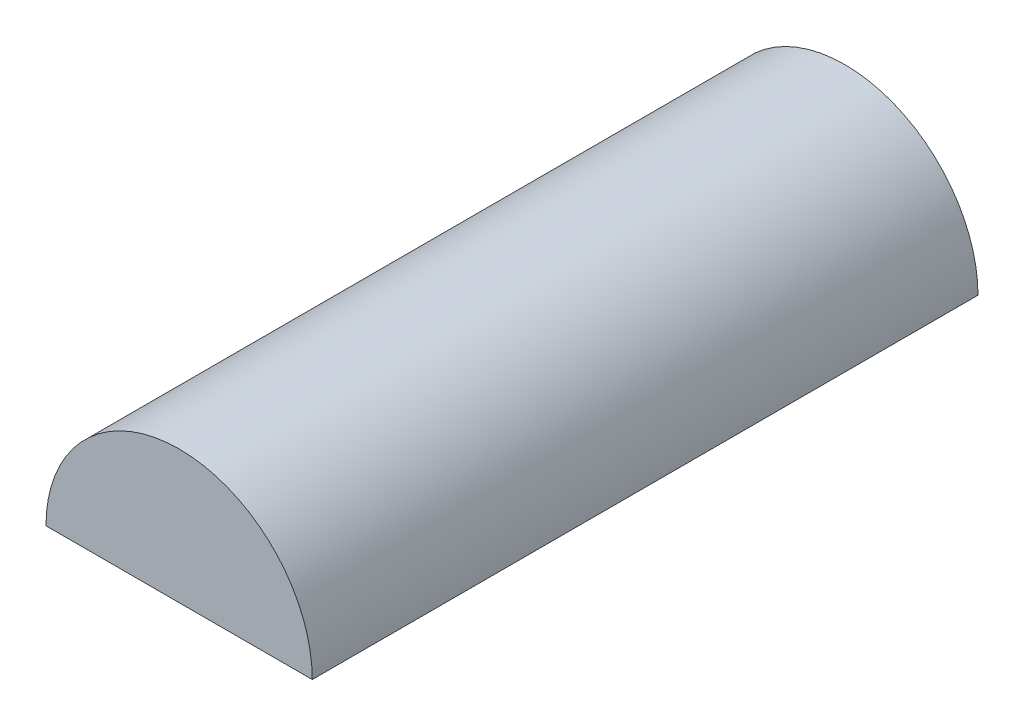
ISO-10303-21;
HEADER;
FILE_DESCRIPTION(('STEP AP214'),'2;1');
FILE_NAME('part.step','',(''),(''),'','','');
FILE_SCHEMA(('AUTOMOTIVE_DESIGN { 1 0 10303 214 1 1 1 1 }'));
ENDSEC;
DATA;
#1=APPLICATION_CONTEXT('core data for automotive mechanical design processes');
#2=APPLICATION_PROTOCOL_DEFINITION('international standard','automotive_design',2000,#1);
#3=PRODUCT_CONTEXT('',#1,'mechanical');
#4=PRODUCT('Part','Part','',(#3));
#5=PRODUCT_RELATED_PRODUCT_CATEGORY('part','',(#4));
#6=PRODUCT_DEFINITION_FORMATION('','',#4);
#7=PRODUCT_DEFINITION_CONTEXT('part definition',#1,'design');
#8=PRODUCT_DEFINITION('design','',#6,#7);
#9=PRODUCT_DEFINITION_SHAPE('','',#8);
#10=(LENGTH_UNIT() NAMED_UNIT(*) SI_UNIT(.MILLI.,.METRE.));
#11=(NAMED_UNIT(*) PLANE_ANGLE_UNIT() SI_UNIT($,.RADIAN.));
#12=(NAMED_UNIT(*) SI_UNIT($,.STERADIAN.) SOLID_ANGLE_UNIT());
#13=UNCERTAINTY_MEASURE_WITH_UNIT(LENGTH_MEASURE(1.E-05),#10,'distance_accuracy_value','');
#14=(GEOMETRIC_REPRESENTATION_CONTEXT(3) GLOBAL_UNCERTAINTY_ASSIGNED_CONTEXT((#13)) GLOBAL_UNIT_ASSIGNED_CONTEXT((#10,
#11,#12)) REPRESENTATION_CONTEXT('',''));
#15=CARTESIAN_POINT('',(0.,0.,0.));
#16=DIRECTION('',(0.,0.,1.));
#17=DIRECTION('',(1.,0.,0.));
#18=AXIS2_PLACEMENT_3D('',#15,#16,#17);
#19=CARTESIAN_POINT('',(0.,0.,500.));
#20=DIRECTION('',(0.,0.,-1.));
#21=DIRECTION('',(-1.,0.,0.));
#22=AXIS2_PLACEMENT_3D('',#19,#20,#21);
#23=CYLINDRICAL_SURFACE('',#22,100.);
#24=CARTESIAN_POINT('',(0.,0.,0.));
#25=DIRECTION('',(0.,0.,1.));
#26=DIRECTION('',(1.,0.,0.));
#27=AXIS2_PLACEMENT_3D('',#24,#25,#26);
#28=CIRCLE('',#27,100.);
#29=CARTESIAN_POINT('',(100.,0.,0.));
#30=VERTEX_POINT('',#29);
#31=CARTESIAN_POINT('',(-100.,0.,0.));
#32=VERTEX_POINT('',#31);
#33=EDGE_CURVE('E67',#30,#32,#28,.T.);
#34=ORIENTED_EDGE('',*,*,#33,.T.);
#35=DIRECTION('',(0.,0.,-1.));
#36=VECTOR('',#35,1.);
#37=CARTESIAN_POINT('',(-100.,0.,500.));
#38=LINE('',#37,#36);
#39=CARTESIAN_POINT('',(-100.,0.,500.));
#40=VERTEX_POINT('',#39);
#41=EDGE_CURVE('E11',#40,#32,#38,.T.);
#42=ORIENTED_EDGE('',*,*,#41,.F.);
#43=CARTESIAN_POINT('',(0.,0.,500.));
#44=DIRECTION('',(0.,0.,1.));
#45=DIRECTION('',(1.,0.,0.));
#46=AXIS2_PLACEMENT_3D('',#43,#44,#45);
#47=CIRCLE('',#46,100.);
#48=CARTESIAN_POINT('',(100.,0.,500.));
#49=VERTEX_POINT('',#48);
#50=EDGE_CURVE('E66',#49,#40,#47,.T.);
#51=ORIENTED_EDGE('',*,*,#50,.F.);
#52=DIRECTION('',(0.,0.,-1.));
#53=VECTOR('',#52,1.);
#54=CARTESIAN_POINT('',(100.,0.,500.));
#55=LINE('',#54,#53);
#56=EDGE_CURVE('E44',#49,#30,#55,.T.);
#57=ORIENTED_EDGE('',*,*,#56,.T.);
#58=EDGE_LOOP('',(#34,#42,#51,#57));
#59=FACE_BOUND('',#58,.T.);
#60=ADVANCED_FACE('F36',(#59),#23,.T.);
#61=CARTESIAN_POINT('',(-100.,0.,500.));
#62=DIRECTION('',(0.,1.,0.));
#63=DIRECTION('',(0.,0.,1.));
#64=AXIS2_PLACEMENT_3D('',#61,#62,#63);
#65=PLANE('',#64);
#66=DIRECTION('',(1.,0.,0.));
#67=VECTOR('',#66,1.);
#68=CARTESIAN_POINT('',(-100.,0.,0.));
#69=LINE('',#68,#67);
#70=EDGE_CURVE('E59',#32,#30,#69,.T.);
#71=ORIENTED_EDGE('',*,*,#70,.T.);
#72=ORIENTED_EDGE('',*,*,#56,.F.);
#73=DIRECTION('',(1.,0.,0.));
#74=VECTOR('',#73,1.);
#75=CARTESIAN_POINT('',(-100.,0.,500.));
#76=LINE('',#75,#74);
#77=EDGE_CURVE('E51',#40,#49,#76,.T.);
#78=ORIENTED_EDGE('',*,*,#77,.F.);
#79=ORIENTED_EDGE('',*,*,#41,.T.);
#80=EDGE_LOOP('',(#71,#72,#78,#79));
#81=FACE_BOUND('',#80,.T.);
#82=ADVANCED_FACE('F62',(#81),#65,.F.);
#83=CARTESIAN_POINT('',(0.,0.,500.));
#84=DIRECTION('',(0.,0.,1.));
#85=DIRECTION('',(1.,0.,0.));
#86=AXIS2_PLACEMENT_3D('',#83,#84,#85);
#87=PLANE('',#86);
#88=ORIENTED_EDGE('',*,*,#50,.T.);
#89=ORIENTED_EDGE('',*,*,#77,.T.);
#90=EDGE_LOOP('',(#88,#89));
#91=FACE_BOUND('',#90,.T.);
#92=ADVANCED_FACE('F74',(#91),#87,.T.);
#93=CARTESIAN_POINT('',(0.,0.,0.));
#94=DIRECTION('',(0.,0.,1.));
#95=DIRECTION('',(1.,0.,0.));
#96=AXIS2_PLACEMENT_3D('',#93,#94,#95);
#97=PLANE('',#96);
#98=ORIENTED_EDGE('',*,*,#33,.F.);
#99=ORIENTED_EDGE('',*,*,#70,.F.);
#100=EDGE_LOOP('',(#98,#99));
#101=FACE_BOUND('',#100,.T.);
#102=ADVANCED_FACE('F70',(#101),#97,.F.);
#103=CLOSED_SHELL('',(#60,#82,#92,#102));
#104=MANIFOLD_SOLID_BREP('B2',#103);
#105=ADVANCED_BREP_SHAPE_REPRESENTATION('',(#18,#104),#14);
#106=SHAPE_DEFINITION_REPRESENTATION(#9,#105);
ENDSEC;
END-ISO-10303-21;
